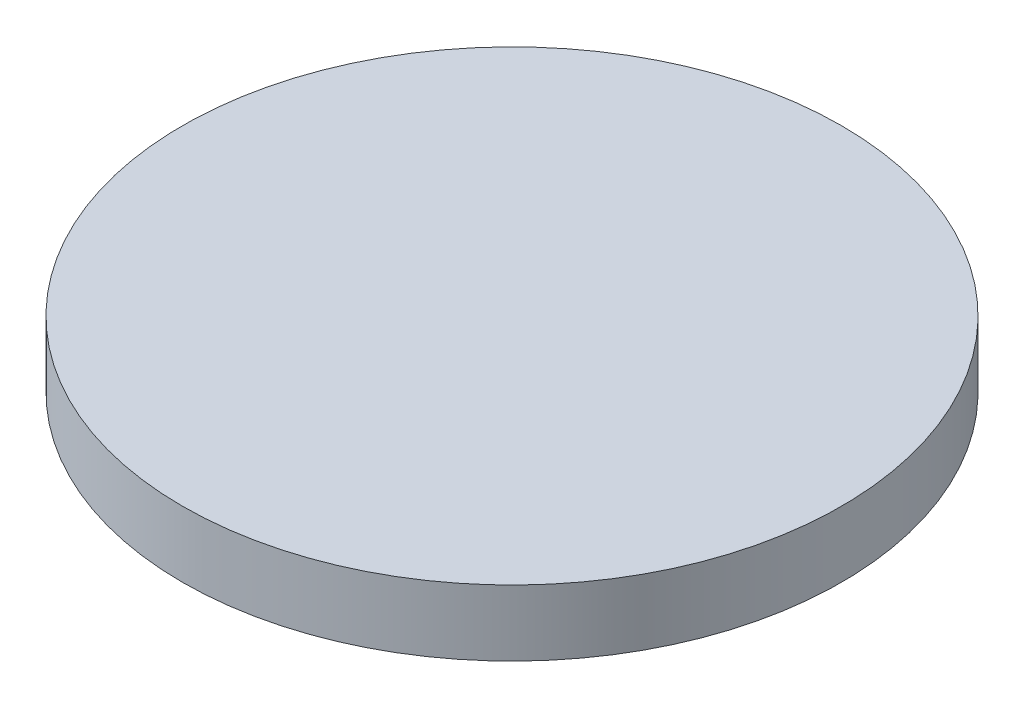
ISO-10303-21;
HEADER;
FILE_DESCRIPTION(('STEP AP214'),'2;1');
FILE_NAME('part.step','',(''),(''),'','','');
FILE_SCHEMA(('AUTOMOTIVE_DESIGN { 1 0 10303 214 1 1 1 1 }'));
ENDSEC;
DATA;
#1=APPLICATION_CONTEXT('core data for automotive mechanical design processes');
#2=APPLICATION_PROTOCOL_DEFINITION('international standard','automotive_design',2000,#1);
#3=PRODUCT_CONTEXT('',#1,'mechanical');
#4=PRODUCT('Part','Part','',(#3));
#5=PRODUCT_RELATED_PRODUCT_CATEGORY('part','',(#4));
#6=PRODUCT_DEFINITION_FORMATION('','',#4);
#7=PRODUCT_DEFINITION_CONTEXT('part definition',#1,'design');
#8=PRODUCT_DEFINITION('design','',#6,#7);
#9=PRODUCT_DEFINITION_SHAPE('','',#8);
#10=(LENGTH_UNIT() NAMED_UNIT(*) SI_UNIT(.MILLI.,.METRE.));
#11=(NAMED_UNIT(*) PLANE_ANGLE_UNIT() SI_UNIT($,.RADIAN.));
#12=(NAMED_UNIT(*) SI_UNIT($,.STERADIAN.) SOLID_ANGLE_UNIT());
#13=UNCERTAINTY_MEASURE_WITH_UNIT(LENGTH_MEASURE(1.E-05),#10,'distance_accuracy_value','');
#14=(GEOMETRIC_REPRESENTATION_CONTEXT(3) GLOBAL_UNCERTAINTY_ASSIGNED_CONTEXT((#13)) GLOBAL_UNIT_ASSIGNED_CONTEXT((#10,
#11,#12)) REPRESENTATION_CONTEXT('',''));
#15=CARTESIAN_POINT('',(0.,0.,0.));
#16=DIRECTION('',(0.,0.,1.));
#17=DIRECTION('',(1.,0.,0.));
#18=AXIS2_PLACEMENT_3D('',#15,#16,#17);
#19=CARTESIAN_POINT('',(0.,-3.175,0.));
#20=DIRECTION('',(0.,-1.,0.));
#21=DIRECTION('',(0.,0.,-1.));
#22=AXIS2_PLACEMENT_3D('',#19,#20,#21);
#23=PLANE('',#22);
#24=CARTESIAN_POINT('',(0.,-3.175,0.));
#25=DIRECTION('',(0.,1.,0.));
#26=DIRECTION('',(0.,0.,1.));
#27=AXIS2_PLACEMENT_3D('',#24,#25,#26);
#28=CIRCLE('',#27,31.75);
#29=CARTESIAN_POINT('',(0.,-3.175,31.75));
#30=VERTEX_POINT('',#29);
#31=EDGE_CURVE('E10',#30,#30,#28,.T.);
#32=ORIENTED_EDGE('',*,*,#31,.F.);
#33=EDGE_LOOP('',(#32));
#34=FACE_BOUND('',#33,.T.);
#35=ADVANCED_FACE('F30',(#34),#23,.T.);
#36=CARTESIAN_POINT('',(0.,3.175,0.));
#37=DIRECTION('',(0.,1.,0.));
#38=DIRECTION('',(0.,0.,1.));
#39=AXIS2_PLACEMENT_3D('',#36,#37,#38);
#40=CYLINDRICAL_SURFACE('',#39,31.75);
#41=ORIENTED_EDGE('',*,*,#31,.T.);
#42=EDGE_LOOP('',(#41));
#43=FACE_BOUND('',#42,.T.);
#44=CARTESIAN_POINT('',(0.,3.175,0.));
#45=DIRECTION('',(0.,1.,0.));
#46=DIRECTION('',(0.,0.,1.));
#47=AXIS2_PLACEMENT_3D('',#44,#45,#46);
#48=CIRCLE('',#47,31.75);
#49=CARTESIAN_POINT('',(0.,3.175,31.75));
#50=VERTEX_POINT('',#49);
#51=EDGE_CURVE('E36',#50,#50,#48,.T.);
#52=ORIENTED_EDGE('',*,*,#51,.F.);
#53=EDGE_LOOP('',(#52));
#54=FACE_BOUND('',#53,.T.);
#55=ADVANCED_FACE('F44',(#43,#54),#40,.T.);
#56=CARTESIAN_POINT('',(0.,3.175,0.));
#57=DIRECTION('',(0.,1.,0.));
#58=DIRECTION('',(0.,0.,1.));
#59=AXIS2_PLACEMENT_3D('',#56,#57,#58);
#60=PLANE('',#59);
#61=ORIENTED_EDGE('',*,*,#51,.T.);
#62=EDGE_LOOP('',(#61));
#63=FACE_BOUND('',#62,.T.);
#64=ADVANCED_FACE('F42',(#63),#60,.T.);
#65=CLOSED_SHELL('',(#35,#55,#64));
#66=MANIFOLD_SOLID_BREP('B2',#65);
#67=ADVANCED_BREP_SHAPE_REPRESENTATION('',(#18,#66),#14);
#68=SHAPE_DEFINITION_REPRESENTATION(#9,#67);
ENDSEC;
END-ISO-10303-21;
